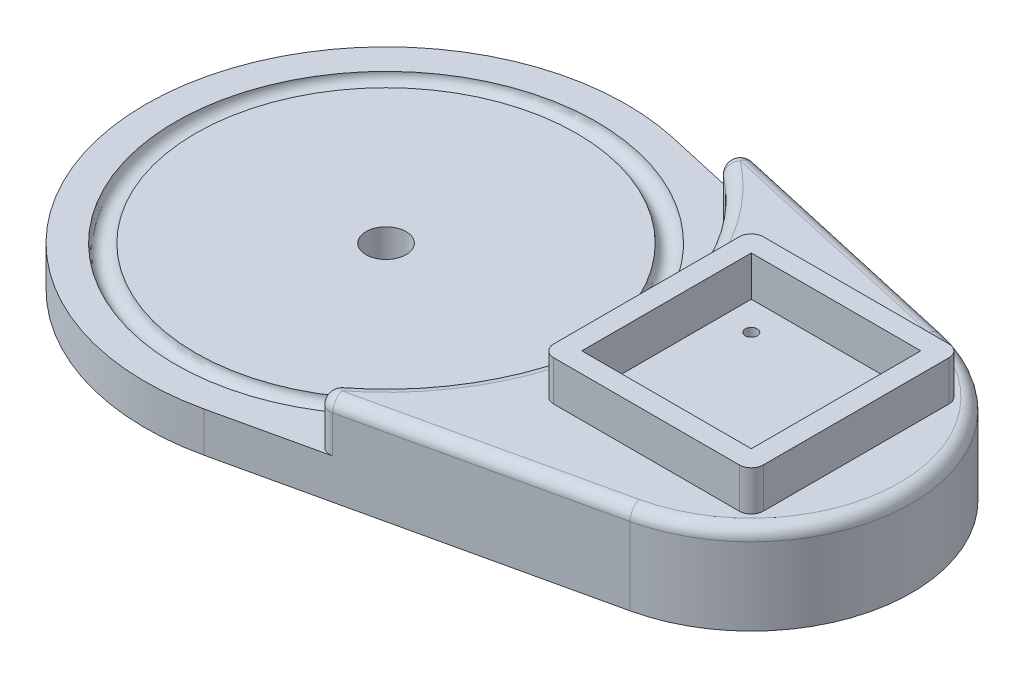
ISO-10303-21;
HEADER;
FILE_DESCRIPTION(('STEP AP214'),'2;1');
FILE_NAME('part.step','',(''),(''),'','','');
FILE_SCHEMA(('AUTOMOTIVE_DESIGN { 1 0 10303 214 1 1 1 1 }'));
ENDSEC;
DATA;
#1=APPLICATION_CONTEXT('core data for automotive mechanical design processes');
#2=APPLICATION_PROTOCOL_DEFINITION('international standard','automotive_design',2000,#1);
#3=PRODUCT_CONTEXT('',#1,'mechanical');
#4=PRODUCT('Part','Part','',(#3));
#5=PRODUCT_RELATED_PRODUCT_CATEGORY('part','',(#4));
#6=PRODUCT_DEFINITION_FORMATION('','',#4);
#7=PRODUCT_DEFINITION_CONTEXT('part definition',#1,'design');
#8=PRODUCT_DEFINITION('design','',#6,#7);
#9=PRODUCT_DEFINITION_SHAPE('','',#8);
#10=(LENGTH_UNIT() NAMED_UNIT(*) SI_UNIT(.MILLI.,.METRE.));
#11=(NAMED_UNIT(*) PLANE_ANGLE_UNIT() SI_UNIT($,.RADIAN.));
#12=(NAMED_UNIT(*) SI_UNIT($,.STERADIAN.) SOLID_ANGLE_UNIT());
#13=UNCERTAINTY_MEASURE_WITH_UNIT(LENGTH_MEASURE(1.E-05),#10,'distance_accuracy_value','');
#14=(GEOMETRIC_REPRESENTATION_CONTEXT(3) GLOBAL_UNCERTAINTY_ASSIGNED_CONTEXT((#13)) GLOBAL_UNIT_ASSIGNED_CONTEXT((#10,
#11,#12)) REPRESENTATION_CONTEXT('',''));
#15=CARTESIAN_POINT('',(0.,0.,0.));
#16=DIRECTION('',(0.,0.,1.));
#17=DIRECTION('',(1.,0.,0.));
#18=AXIS2_PLACEMENT_3D('',#15,#16,#17);
#19=CARTESIAN_POINT('',(0.,10.,0.));
#20=DIRECTION('',(0.,-1.,0.));
#21=DIRECTION('',(0.,0.,-1.));
#22=AXIS2_PLACEMENT_3D('',#19,#20,#21);
#23=CYLINDRICAL_SURFACE('',#22,60.);
#24=DIRECTION('',(0.,1.,0.));
#25=VECTOR('',#24,1.);
#26=CARTESIAN_POINT('',(13.1651124520022,0.,58.5378494149396));
#27=LINE('',#26,#25);
#28=CARTESIAN_POINT('',(13.1651124520022,0.,58.5378494149395));
#29=VERTEX_POINT('',#28);
#30=CARTESIAN_POINT('',(13.1651124520022,10.,58.5378494149395));
#31=VERTEX_POINT('',#30);
#32=EDGE_CURVE('E307',#29,#31,#27,.T.);
#33=ORIENTED_EDGE('',*,*,#32,.T.);
#34=CARTESIAN_POINT('',(0.,10.,0.));
#35=DIRECTION('',(0.,1.,0.));
#36=DIRECTION('',(0.,0.,1.));
#37=AXIS2_PLACEMENT_3D('',#34,#35,#36);
#38=CIRCLE('',#37,60.);
#39=CARTESIAN_POINT('',(13.1651124520022,10.,-58.5378494149395));
#40=VERTEX_POINT('',#39);
#41=EDGE_CURVE('E325',#40,#31,#38,.T.);
#42=ORIENTED_EDGE('',*,*,#41,.F.);
#43=DIRECTION('',(0.,1.,0.));
#44=VECTOR('',#43,1.);
#45=CARTESIAN_POINT('',(13.1651124520022,0.,-58.5378494149396));
#46=LINE('',#45,#44);
#47=CARTESIAN_POINT('',(13.1651124520022,0.,-58.5378494149396));
#48=VERTEX_POINT('',#47);
#49=EDGE_CURVE('E311',#48,#40,#46,.T.);
#50=ORIENTED_EDGE('',*,*,#49,.F.);
#51=CARTESIAN_POINT('',(0.,0.,0.));
#52=DIRECTION('',(0.,1.,0.));
#53=DIRECTION('',(0.,0.,1.));
#54=AXIS2_PLACEMENT_3D('',#51,#52,#53);
#55=CIRCLE('',#54,60.);
#56=EDGE_CURVE('E320',#48,#29,#55,.T.);
#57=ORIENTED_EDGE('',*,*,#56,.T.);
#58=EDGE_LOOP('',(#33,#42,#50,#57));
#59=FACE_BOUND('',#58,.T.);
#60=ADVANCED_FACE('F106',(#59),#23,.T.);
#61=CARTESIAN_POINT('',(0.,10.,0.));
#62=DIRECTION('',(0.,1.,0.));
#63=DIRECTION('',(0.,0.,1.));
#64=AXIS2_PLACEMENT_3D('',#61,#62,#63);
#65=PLANE('',#64);
#66=ORIENTED_EDGE('',*,*,#41,.T.);
#67=DIRECTION('',(-0.975630823582326,0.,0.219418540866703));
#68=VECTOR('',#67,1.);
#69=CARTESIAN_POINT('',(13.1651124520022,10.,58.5378494149396));
#70=LINE('',#69,#68);
#71=CARTESIAN_POINT('',(39.3440345616924,10.,52.6502321401184));
#72=VERTEX_POINT('',#71);
#73=EDGE_CURVE('E362',#72,#31,#70,.T.);
#74=ORIENTED_EDGE('',*,*,#73,.F.);
#75=CARTESIAN_POINT('',(38.6857789390923,10.,49.7233396693714));
#76=DIRECTION('',(0.,1.,0.));
#77=DIRECTION('',(0.,0.,1.));
#78=AXIS2_PLACEMENT_3D('',#75,#76,#77);
#79=CIRCLE('',#78,3.);
#80=CARTESIAN_POINT('',(36.8435989896117,10.,47.3555615898775));
#81=VERTEX_POINT('',#80);
#82=EDGE_CURVE('E366',#72,#81,#79,.F.);
#83=ORIENTED_EDGE('',*,*,#82,.T.);
#84=CARTESIAN_POINT('',(36.8435989896117,10.,-47.3555615898775));
#85=VERTEX_POINT('',#84);
#86=EDGE_CURVE('E321',#81,#85,#38,.T.);
#87=ORIENTED_EDGE('',*,*,#86,.T.);
#88=CARTESIAN_POINT('',(38.6857789390923,10.,-49.7233396693714));
#89=DIRECTION('',(0.,1.,0.));
#90=DIRECTION('',(0.,0.,1.));
#91=AXIS2_PLACEMENT_3D('',#88,#89,#90);
#92=CIRCLE('',#91,3.);
#93=CARTESIAN_POINT('',(39.3440345616924,10.,-52.6502321401184));
#94=VERTEX_POINT('',#93);
#95=EDGE_CURVE('E364',#85,#94,#92,.F.);
#96=ORIENTED_EDGE('',*,*,#95,.T.);
#97=DIRECTION('',(0.975630823582326,0.,0.219418540866703));
#98=VECTOR('',#97,1.);
#99=CARTESIAN_POINT('',(13.1651124520022,10.,-58.5378494149395));
#100=LINE('',#99,#98);
#101=EDGE_CURVE('E341',#40,#94,#100,.T.);
#102=ORIENTED_EDGE('',*,*,#101,.F.);
#103=EDGE_LOOP('',(#66,#74,#83,#87,#96,#102));
#104=FACE_BOUND('',#103,.T.);
#105=CARTESIAN_POINT('',(0.,10.,0.));
#106=DIRECTION('',(0.,1.,0.));
#107=DIRECTION('',(0.,0.,1.));
#108=AXIS2_PLACEMENT_3D('',#105,#106,#107);
#109=CIRCLE('',#108,52.5);
#110=CARTESIAN_POINT('',(52.5,10.,0.));
#111=VERTEX_POINT('',#110);
#112=EDGE_CURVE('E329',#111,#111,#109,.F.);
#113=ORIENTED_EDGE('',*,*,#112,.T.);
#114=EDGE_LOOP('',(#113));
#115=FACE_BOUND('',#114,.T.);
#116=ADVANCED_FACE('F486',(#104,#115),#65,.T.);
#117=CARTESIAN_POINT('',(0.,0.,0.));
#118=DIRECTION('',(0.,1.,0.));
#119=DIRECTION('',(0.,0.,1.));
#120=AXIS2_PLACEMENT_3D('',#117,#118,#119);
#121=PLANE('',#120);
#122=CARTESIAN_POINT('',(0.,0.,0.));
#123=DIRECTION('',(0.,1.,0.));
#124=DIRECTION('',(0.,0.,1.));
#125=AXIS2_PLACEMENT_3D('',#122,#123,#124);
#126=CIRCLE('',#125,5.);
#127=CARTESIAN_POINT('',(0.,0.,5.));
#128=VERTEX_POINT('',#127);
#129=EDGE_CURVE('E572',#128,#128,#126,.T.);
#130=ORIENTED_EDGE('',*,*,#129,.T.);
#131=EDGE_LOOP('',(#130));
#132=FACE_BOUND('',#131,.T.);
#133=CARTESIAN_POINT('',(105.15,0.,-14.));
#134=DIRECTION('',(0.,1.,0.));
#135=DIRECTION('',(0.,0.,1.));
#136=AXIS2_PLACEMENT_3D('',#133,#134,#135);
#137=CIRCLE('',#136,1.5);
#138=CARTESIAN_POINT('',(105.15,0.,-12.5));
#139=VERTEX_POINT('',#138);
#140=EDGE_CURVE('E564',#139,#139,#137,.T.);
#141=ORIENTED_EDGE('',*,*,#140,.T.);
#142=EDGE_LOOP('',(#141));
#143=FACE_BOUND('',#142,.T.);
#144=CARTESIAN_POINT('',(105.15,0.,14.));
#145=DIRECTION('',(0.,1.,0.));
#146=DIRECTION('',(0.,0.,1.));
#147=AXIS2_PLACEMENT_3D('',#144,#145,#146);
#148=CIRCLE('',#147,1.5);
#149=CARTESIAN_POINT('',(105.15,0.,15.5));
#150=VERTEX_POINT('',#149);
#151=EDGE_CURVE('E567',#150,#150,#148,.T.);
#152=ORIENTED_EDGE('',*,*,#151,.T.);
#153=EDGE_LOOP('',(#152));
#154=FACE_BOUND('',#153,.T.);
#155=CARTESIAN_POINT('',(77.15,0.,14.));
#156=DIRECTION('',(0.,1.,0.));
#157=DIRECTION('',(0.,0.,1.));
#158=AXIS2_PLACEMENT_3D('',#155,#156,#157);
#159=CIRCLE('',#158,1.5);
#160=CARTESIAN_POINT('',(77.15,0.,15.5));
#161=VERTEX_POINT('',#160);
#162=EDGE_CURVE('E563',#161,#161,#159,.T.);
#163=ORIENTED_EDGE('',*,*,#162,.T.);
#164=EDGE_LOOP('',(#163));
#165=FACE_BOUND('',#164,.T.);
#166=CARTESIAN_POINT('',(77.15,0.,-14.));
#167=DIRECTION('',(0.,1.,0.));
#168=DIRECTION('',(0.,0.,1.));
#169=AXIS2_PLACEMENT_3D('',#166,#167,#168);
#170=CIRCLE('',#169,1.5);
#171=CARTESIAN_POINT('',(77.15,0.,-12.5));
#172=VERTEX_POINT('',#171);
#173=EDGE_CURVE('E422',#172,#172,#170,.T.);
#174=ORIENTED_EDGE('',*,*,#173,.T.);
#175=EDGE_LOOP('',(#174));
#176=FACE_BOUND('',#175,.T.);
#177=ORIENTED_EDGE('',*,*,#56,.F.);
#178=DIRECTION('',(-0.975630823582326,0.,-0.219418540866703));
#179=VECTOR('',#178,1.);
#180=CARTESIAN_POINT('',(13.1651124520022,0.,-58.5378494149395));
#181=LINE('',#180,#179);
#182=CARTESIAN_POINT('',(99.9267416346681,0.,-39.025232943293));
#183=VERTEX_POINT('',#182);
#184=EDGE_CURVE('E303',#183,#48,#181,.T.);
#185=ORIENTED_EDGE('',*,*,#184,.F.);
#186=CARTESIAN_POINT('',(91.15,0.,0.));
#187=DIRECTION('',(0.,1.,0.));
#188=DIRECTION('',(0.,0.,1.));
#189=AXIS2_PLACEMENT_3D('',#186,#187,#188);
#190=CIRCLE('',#189,40.);
#191=CARTESIAN_POINT('',(99.9267416346681,0.,39.025232943293));
#192=VERTEX_POINT('',#191);
#193=EDGE_CURVE('E299',#192,#183,#190,.T.);
#194=ORIENTED_EDGE('',*,*,#193,.F.);
#195=DIRECTION('',(-0.975630823582326,0.,0.219418540866703));
#196=VECTOR('',#195,1.);
#197=CARTESIAN_POINT('',(13.1651124520022,0.,58.5378494149395));
#198=LINE('',#197,#196);
#199=EDGE_CURVE('E296',#192,#29,#198,.T.);
#200=ORIENTED_EDGE('',*,*,#199,.T.);
#201=EDGE_LOOP('',(#177,#185,#194,#200));
#202=FACE_BOUND('',#201,.T.);
#203=ADVANCED_FACE('F493',(#132,#143,#154,#165,#176,#202),#121,.F.);
#204=CARTESIAN_POINT('',(0.,10.,0.));
#205=DIRECTION('',(0.,1.,0.));
#206=DIRECTION('',(0.,0.,1.));
#207=AXIS2_PLACEMENT_3D('',#204,#205,#206);
#208=TOROIDAL_SURFACE('',#207,50.,2.5);
#209=CARTESIAN_POINT('',(50.,10.,0.));
#210=DIRECTION('',(0.,0.,1.));
#211=DIRECTION('',(1.,0.,0.));
#212=AXIS2_PLACEMENT_3D('',#209,#210,#211);
#213=CIRCLE('',#212,2.5);
#214=CARTESIAN_POINT('',(47.5,10.,0.));
#215=VERTEX_POINT('',#214);
#216=EDGE_CURVE('E310',#215,#111,#213,.T.);
#217=ORIENTED_EDGE('',*,*,#216,.F.);
#218=CARTESIAN_POINT('',(0.,10.,0.));
#219=DIRECTION('',(0.,-1.,0.));
#220=DIRECTION('',(0.,0.,-1.));
#221=AXIS2_PLACEMENT_3D('',#218,#219,#220);
#222=CIRCLE('',#221,47.5);
#223=EDGE_CURVE('E324',#215,#215,#222,.F.);
#224=ORIENTED_EDGE('',*,*,#223,.F.);
#225=ORIENTED_EDGE('',*,*,#216,.T.);
#226=ORIENTED_EDGE('',*,*,#112,.F.);
#227=EDGE_LOOP('',(#217,#224,#225,#226));
#228=FACE_BOUND('',#227,.T.);
#229=ADVANCED_FACE('F584',(#228),#208,.F.);
#230=CARTESIAN_POINT('',(0.,10.,0.));
#231=DIRECTION('',(0.,1.,0.));
#232=DIRECTION('',(0.,0.,1.));
#233=AXIS2_PLACEMENT_3D('',#230,#231,#232);
#234=CIRCLE('',#233,5.);
#235=CARTESIAN_POINT('',(0.,10.,5.));
#236=VERTEX_POINT('',#235);
#237=EDGE_CURVE('E110',#236,#236,#234,.T.);
#238=ORIENTED_EDGE('',*,*,#237,.F.);
#239=EDGE_LOOP('',(#238));
#240=FACE_BOUND('',#239,.T.);
#241=ORIENTED_EDGE('',*,*,#223,.T.);
#242=EDGE_LOOP('',(#241));
#243=FACE_BOUND('',#242,.T.);
#244=ADVANCED_FACE('F484',(#240,#243),#65,.T.);
#245=CARTESIAN_POINT('',(0.,22.3,0.));
#246=DIRECTION('',(0.,1.,0.));
#247=DIRECTION('',(0.,0.,1.));
#248=AXIS2_PLACEMENT_3D('',#245,#246,#247);
#249=PLANE('',#248);
#250=DIRECTION('',(0.,0.,1.));
#251=VECTOR('',#250,1.);
#252=CARTESIAN_POINT('',(65.,22.3,0.));
#253=LINE('',#252,#251);
#254=CARTESIAN_POINT('',(65.,22.3,-23.15));
#255=VERTEX_POINT('',#254);
#256=CARTESIAN_POINT('',(65.,22.3,23.15));
#257=VERTEX_POINT('',#256);
#258=EDGE_CURVE('E433',#255,#257,#253,.T.);
#259=ORIENTED_EDGE('',*,*,#258,.F.);
#260=CARTESIAN_POINT('',(68.,22.3,-23.15));
#261=DIRECTION('',(0.,1.,0.));
#262=DIRECTION('',(0.,0.,1.));
#263=AXIS2_PLACEMENT_3D('',#260,#261,#262);
#264=CIRCLE('',#263,3.);
#265=CARTESIAN_POINT('',(68.,22.3,-26.15));
#266=VERTEX_POINT('',#265);
#267=EDGE_CURVE('E413',#255,#266,#264,.F.);
#268=ORIENTED_EDGE('',*,*,#267,.T.);
#269=DIRECTION('',(1.,0.,0.));
#270=VECTOR('',#269,1.);
#271=CARTESIAN_POINT('',(0.,22.3,-26.15));
#272=LINE('',#271,#270);
#273=CARTESIAN_POINT('',(114.3,22.3,-26.15));
#274=VERTEX_POINT('',#273);
#275=EDGE_CURVE('E429',#266,#274,#272,.T.);
#276=ORIENTED_EDGE('',*,*,#275,.T.);
#277=CARTESIAN_POINT('',(114.3,22.3,-23.15));
#278=DIRECTION('',(0.,1.,0.));
#279=DIRECTION('',(0.,0.,1.));
#280=AXIS2_PLACEMENT_3D('',#277,#278,#279);
#281=CIRCLE('',#280,3.);
#282=CARTESIAN_POINT('',(117.3,22.3,-23.15));
#283=VERTEX_POINT('',#282);
#284=EDGE_CURVE('E415',#274,#283,#281,.F.);
#285=ORIENTED_EDGE('',*,*,#284,.T.);
#286=DIRECTION('',(0.,0.,1.));
#287=VECTOR('',#286,1.);
#288=CARTESIAN_POINT('',(117.3,22.3,0.));
#289=LINE('',#288,#287);
#290=CARTESIAN_POINT('',(117.3,22.3,23.15));
#291=VERTEX_POINT('',#290);
#292=EDGE_CURVE('E443',#283,#291,#289,.T.);
#293=ORIENTED_EDGE('',*,*,#292,.T.);
#294=CARTESIAN_POINT('',(114.3,22.3,23.15));
#295=DIRECTION('',(0.,1.,0.));
#296=DIRECTION('',(0.,0.,1.));
#297=AXIS2_PLACEMENT_3D('',#294,#295,#296);
#298=CIRCLE('',#297,3.);
#299=CARTESIAN_POINT('',(114.3,22.3,26.15));
#300=VERTEX_POINT('',#299);
#301=EDGE_CURVE('E115',#291,#300,#298,.F.);
#302=ORIENTED_EDGE('',*,*,#301,.T.);
#303=DIRECTION('',(1.,0.,0.));
#304=VECTOR('',#303,1.);
#305=CARTESIAN_POINT('',(0.,22.3,26.15));
#306=LINE('',#305,#304);
#307=CARTESIAN_POINT('',(68.,22.3,26.15));
#308=VERTEX_POINT('',#307);
#309=EDGE_CURVE('E437',#308,#300,#306,.T.);
#310=ORIENTED_EDGE('',*,*,#309,.F.);
#311=CARTESIAN_POINT('',(68.,22.3,23.15));
#312=DIRECTION('',(0.,1.,0.));
#313=DIRECTION('',(0.,0.,1.));
#314=AXIS2_PLACEMENT_3D('',#311,#312,#313);
#315=CIRCLE('',#314,3.);
#316=EDGE_CURVE('E12',#308,#257,#315,.F.);
#317=ORIENTED_EDGE('',*,*,#316,.T.);
#318=EDGE_LOOP('',(#259,#268,#276,#285,#293,#302,#310,#317));
#319=FACE_BOUND('',#318,.T.);
#320=CARTESIAN_POINT('',(91.15,22.3,0.));
#321=DIRECTION('',(0.,1.,0.));
#322=DIRECTION('',(0.,0.,1.));
#323=AXIS2_PLACEMENT_3D('',#320,#321,#322);
#324=CIRCLE('',#323,37.);
#325=CARTESIAN_POINT('',(99.268486012068,22.3,36.098340472546));
#326=VERTEX_POINT('',#325);
#327=CARTESIAN_POINT('',(99.268486012068,22.3,-36.098340472546));
#328=VERTEX_POINT('',#327);
#329=EDGE_CURVE('E336',#326,#328,#324,.T.);
#330=ORIENTED_EDGE('',*,*,#329,.T.);
#331=DIRECTION('',(-0.975630823582326,0.,-0.219418540866703));
#332=VECTOR('',#331,1.);
#333=CARTESIAN_POINT('',(12.5068568294021,22.3,-55.6109569441926));
#334=LINE('',#333,#332);
#335=CARTESIAN_POINT('',(38.6857789390923,22.3,-49.7233396693714));
#336=VERTEX_POINT('',#335);
#337=EDGE_CURVE('E338',#328,#336,#334,.T.);
#338=ORIENTED_EDGE('',*,*,#337,.T.);
#339=CARTESIAN_POINT('',(0.,22.3,0.));
#340=DIRECTION('',(0.,1.,0.));
#341=DIRECTION('',(0.,0.,1.));
#342=AXIS2_PLACEMENT_3D('',#339,#340,#341);
#343=CIRCLE('',#342,63.);
#344=CARTESIAN_POINT('',(38.6857789390923,22.3,49.7233396693714));
#345=VERTEX_POINT('',#344);
#346=EDGE_CURVE('E332',#336,#345,#343,.F.);
#347=ORIENTED_EDGE('',*,*,#346,.T.);
#348=DIRECTION('',(-0.975630823582326,0.,0.219418540866703));
#349=VECTOR('',#348,1.);
#350=CARTESIAN_POINT('',(99.268486012068,22.3,36.098340472546));
#351=LINE('',#350,#349);
#352=EDGE_CURVE('E334',#345,#326,#351,.F.);
#353=ORIENTED_EDGE('',*,*,#352,.T.);
#354=EDGE_LOOP('',(#330,#338,#347,#353));
#355=FACE_BOUND('',#354,.T.);
#356=ADVANCED_FACE('F467',(#319,#355),#249,.T.);
#357=CARTESIAN_POINT('',(13.1651124520022,0.,58.5378494149395));
#358=DIRECTION('',(-0.219418540866703,0.,-0.975630823582325));
#359=DIRECTION('',(-0.975630823582326,0.,0.219418540866703));
#360=AXIS2_PLACEMENT_3D('',#357,#358,#359);
#361=PLANE('',#360);
#362=DIRECTION('',(0.,1.,0.));
#363=VECTOR('',#362,1.);
#364=CARTESIAN_POINT('',(39.3440345616924,0.,52.6502321401184));
#365=LINE('',#364,#363);
#366=CARTESIAN_POINT('',(39.3440345616924,19.3,52.6502321401184));
#367=VERTEX_POINT('',#366);
#368=EDGE_CURVE('E359',#367,#72,#365,.F.);
#369=ORIENTED_EDGE('',*,*,#368,.T.);
#370=ORIENTED_EDGE('',*,*,#73,.T.);
#371=ORIENTED_EDGE('',*,*,#32,.F.);
#372=ORIENTED_EDGE('',*,*,#199,.F.);
#373=DIRECTION('',(0.,1.,0.));
#374=VECTOR('',#373,1.);
#375=CARTESIAN_POINT('',(99.9267416346681,0.,39.025232943293));
#376=LINE('',#375,#374);
#377=CARTESIAN_POINT('',(99.9267416346681,19.3,39.025232943293));
#378=VERTEX_POINT('',#377);
#379=EDGE_CURVE('E306',#192,#378,#376,.T.);
#380=ORIENTED_EDGE('',*,*,#379,.T.);
#381=DIRECTION('',(-0.975630823582326,0.,0.219418540866703));
#382=VECTOR('',#381,1.);
#383=CARTESIAN_POINT('',(13.1651124520022,19.3,58.5378494149395));
#384=LINE('',#383,#382);
#385=EDGE_CURVE('E357',#378,#367,#384,.T.);
#386=ORIENTED_EDGE('',*,*,#385,.T.);
#387=EDGE_LOOP('',(#369,#370,#371,#372,#380,#386));
#388=FACE_BOUND('',#387,.T.);
#389=ADVANCED_FACE('F483',(#388),#361,.F.);
#390=CARTESIAN_POINT('',(0.,0.,0.));
#391=DIRECTION('',(0.,1.,0.));
#392=DIRECTION('',(0.,0.,1.));
#393=AXIS2_PLACEMENT_3D('',#390,#391,#392);
#394=CYLINDRICAL_SURFACE('',#393,60.);
#395=CARTESIAN_POINT('',(0.,19.3,0.));
#396=DIRECTION('',(0.,1.,0.));
#397=DIRECTION('',(0.,0.,1.));
#398=AXIS2_PLACEMENT_3D('',#395,#396,#397);
#399=CIRCLE('',#398,60.);
#400=CARTESIAN_POINT('',(36.8435989896117,19.3,47.3555615898775));
#401=VERTEX_POINT('',#400);
#402=CARTESIAN_POINT('',(36.8435989896117,19.3,-47.3555615898775));
#403=VERTEX_POINT('',#402);
#404=EDGE_CURVE('E351',#401,#403,#399,.T.);
#405=ORIENTED_EDGE('',*,*,#404,.T.);
#406=DIRECTION('',(0.,1.,0.));
#407=VECTOR('',#406,1.);
#408=CARTESIAN_POINT('',(36.8435989896117,0.,-47.3555615898775));
#409=LINE('',#408,#407);
#410=EDGE_CURVE('E355',#403,#85,#409,.F.);
#411=ORIENTED_EDGE('',*,*,#410,.T.);
#412=ORIENTED_EDGE('',*,*,#86,.F.);
#413=DIRECTION('',(0.,1.,0.));
#414=VECTOR('',#413,1.);
#415=CARTESIAN_POINT('',(36.8435989896117,0.,47.3555615898775));
#416=LINE('',#415,#414);
#417=EDGE_CURVE('E353',#81,#401,#416,.T.);
#418=ORIENTED_EDGE('',*,*,#417,.T.);
#419=EDGE_LOOP('',(#405,#411,#412,#418));
#420=FACE_BOUND('',#419,.T.);
#421=ADVANCED_FACE('F596',(#420),#394,.F.);
#422=CARTESIAN_POINT('',(13.1651124520022,0.,-58.5378494149395));
#423=DIRECTION('',(0.219418540866703,0.,-0.975630823582325));
#424=DIRECTION('',(-0.975630823582326,0.,-0.219418540866703));
#425=AXIS2_PLACEMENT_3D('',#422,#423,#424);
#426=PLANE('',#425);
#427=DIRECTION('',(0.,-1.,0.));
#428=VECTOR('',#427,1.);
#429=CARTESIAN_POINT('',(39.3440345616924,22.3,-52.6502321401184));
#430=LINE('',#429,#428);
#431=CARTESIAN_POINT('',(39.3440345616924,19.3,-52.6502321401184));
#432=VERTEX_POINT('',#431);
#433=EDGE_CURVE('E344',#94,#432,#430,.F.);
#434=ORIENTED_EDGE('',*,*,#433,.T.);
#435=DIRECTION('',(-0.975630823582326,0.,-0.219418540866703));
#436=VECTOR('',#435,1.);
#437=CARTESIAN_POINT('',(13.1651124520022,19.3,-58.5378494149395));
#438=LINE('',#437,#436);
#439=CARTESIAN_POINT('',(99.9267416346681,19.3,-39.025232943293));
#440=VERTEX_POINT('',#439);
#441=EDGE_CURVE('E346',#432,#440,#438,.F.);
#442=ORIENTED_EDGE('',*,*,#441,.T.);
#443=DIRECTION('',(0.,1.,0.));
#444=VECTOR('',#443,1.);
#445=CARTESIAN_POINT('',(99.9267416346681,0.,-39.025232943293));
#446=LINE('',#445,#444);
#447=EDGE_CURVE('E314',#183,#440,#446,.T.);
#448=ORIENTED_EDGE('',*,*,#447,.F.);
#449=ORIENTED_EDGE('',*,*,#184,.T.);
#450=ORIENTED_EDGE('',*,*,#49,.T.);
#451=ORIENTED_EDGE('',*,*,#101,.T.);
#452=EDGE_LOOP('',(#434,#442,#448,#449,#450,#451));
#453=FACE_BOUND('',#452,.T.);
#454=ADVANCED_FACE('F600',(#453),#426,.T.);
#455=CARTESIAN_POINT('',(91.15,0.,0.));
#456=DIRECTION('',(0.,1.,0.));
#457=DIRECTION('',(0.,0.,1.));
#458=AXIS2_PLACEMENT_3D('',#455,#456,#457);
#459=CYLINDRICAL_SURFACE('',#458,40.);
#460=ORIENTED_EDGE('',*,*,#447,.T.);
#461=CARTESIAN_POINT('',(91.15,19.3,0.));
#462=DIRECTION('',(0.,1.,0.));
#463=DIRECTION('',(0.,0.,1.));
#464=AXIS2_PLACEMENT_3D('',#461,#462,#463);
#465=CIRCLE('',#464,40.);
#466=EDGE_CURVE('E349',#440,#378,#465,.F.);
#467=ORIENTED_EDGE('',*,*,#466,.T.);
#468=ORIENTED_EDGE('',*,*,#379,.F.);
#469=ORIENTED_EDGE('',*,*,#193,.T.);
#470=EDGE_LOOP('',(#460,#467,#468,#469));
#471=FACE_BOUND('',#470,.T.);
#472=ADVANCED_FACE('F528',(#471),#459,.T.);
#473=CARTESIAN_POINT('',(38.6857789390923,0.,49.7233396693714));
#474=DIRECTION('',(0.,1.,0.));
#475=DIRECTION('',(0.,0.,1.));
#476=AXIS2_PLACEMENT_3D('',#473,#474,#475);
#477=CYLINDRICAL_SURFACE('',#476,3.);
#478=CARTESIAN_POINT('',(38.6857789390923,19.3,49.7233396693714));
#479=DIRECTION('',(0.,1.,0.));
#480=DIRECTION('',(0.,0.,1.));
#481=AXIS2_PLACEMENT_3D('',#478,#479,#480);
#482=CIRCLE('',#481,3.);
#483=EDGE_CURVE('E300',#401,#367,#482,.T.);
#484=ORIENTED_EDGE('',*,*,#483,.F.);
#485=ORIENTED_EDGE('',*,*,#417,.F.);
#486=ORIENTED_EDGE('',*,*,#82,.F.);
#487=ORIENTED_EDGE('',*,*,#368,.F.);
#488=EDGE_LOOP('',(#484,#485,#486,#487));
#489=FACE_BOUND('',#488,.T.);
#490=ADVANCED_FACE('F525',(#489),#477,.T.);
#491=CARTESIAN_POINT('',(38.6857789390923,19.3,49.7233396693714));
#492=DIRECTION('',(0.,1.,0.));
#493=DIRECTION('',(0.,0.,1.));
#494=AXIS2_PLACEMENT_3D('',#491,#492,#493);
#495=SPHERICAL_SURFACE('',#494,3.);
#496=CARTESIAN_POINT('',(38.6857789390923,19.3,49.7233396693714));
#497=DIRECTION('',(-0.789259359831293,0.,0.614059983160194));
#498=DIRECTION('',(0.614059983160194,0.,0.789259359831293));
#499=AXIS2_PLACEMENT_3D('',#496,#497,#498);
#500=CIRCLE('',#499,3.);
#501=EDGE_CURVE('E379',#401,#345,#500,.F.);
#502=ORIENTED_EDGE('',*,*,#501,.F.);
#503=ORIENTED_EDGE('',*,*,#483,.T.);
#504=CARTESIAN_POINT('',(38.6857789390923,19.3,49.7233396693714));
#505=DIRECTION('',(-0.975630823582325,0.,0.219418540866705));
#506=DIRECTION('',(0.219418540866705,0.,0.975630823582325));
#507=AXIS2_PLACEMENT_3D('',#504,#505,#506);
#508=CIRCLE('',#507,3.);
#509=EDGE_CURVE('E382',#345,#367,#508,.F.);
#510=ORIENTED_EDGE('',*,*,#509,.F.);
#511=EDGE_LOOP('',(#502,#503,#510));
#512=FACE_BOUND('',#511,.T.);
#513=ADVANCED_FACE('F521',(#512),#495,.T.);
#514=CARTESIAN_POINT('',(12.5068568294021,19.3,55.6109569441926));
#515=DIRECTION('',(0.975630823582326,0.,-0.219418540866703));
#516=DIRECTION('',(-0.219418540866703,0.,-0.975630823582326));
#517=AXIS2_PLACEMENT_3D('',#514,#515,#516);
#518=CYLINDRICAL_SURFACE('',#517,3.);
#519=ORIENTED_EDGE('',*,*,#509,.T.);
#520=ORIENTED_EDGE('',*,*,#385,.F.);
#521=CARTESIAN_POINT('',(99.268486012068,19.3,36.098340472546));
#522=DIRECTION('',(0.975630823582326,0.,-0.219418540866702));
#523=DIRECTION('',(-0.219418540866702,0.,-0.975630823582326));
#524=AXIS2_PLACEMENT_3D('',#521,#522,#523);
#525=CIRCLE('',#524,3.);
#526=EDGE_CURVE('E376',#326,#378,#525,.T.);
#527=ORIENTED_EDGE('',*,*,#526,.F.);
#528=ORIENTED_EDGE('',*,*,#352,.F.);
#529=EDGE_LOOP('',(#519,#520,#527,#528));
#530=FACE_BOUND('',#529,.T.);
#531=ADVANCED_FACE('F517',(#530),#518,.T.);
#532=CARTESIAN_POINT('',(0.,19.3,0.));
#533=DIRECTION('',(0.,1.,0.));
#534=DIRECTION('',(0.,0.,1.));
#535=AXIS2_PLACEMENT_3D('',#532,#533,#534);
#536=TOROIDAL_SURFACE('',#535,63.,3.);
#537=ORIENTED_EDGE('',*,*,#501,.T.);
#538=ORIENTED_EDGE('',*,*,#346,.F.);
#539=CARTESIAN_POINT('',(38.6857789390923,19.3,-49.7233396693714));
#540=DIRECTION('',(-0.789259359831291,0.,-0.614059983160196));
#541=DIRECTION('',(-0.614059983160196,0.,0.789259359831291));
#542=AXIS2_PLACEMENT_3D('',#539,#540,#541);
#543=CIRCLE('',#542,3.);
#544=EDGE_CURVE('E373',#403,#336,#543,.T.);
#545=ORIENTED_EDGE('',*,*,#544,.F.);
#546=ORIENTED_EDGE('',*,*,#404,.F.);
#547=EDGE_LOOP('',(#537,#538,#545,#546));
#548=FACE_BOUND('',#547,.T.);
#549=ADVANCED_FACE('F513',(#548),#536,.T.);
#550=CARTESIAN_POINT('',(38.6857789390923,0.,-49.7233396693714));
#551=DIRECTION('',(0.,1.,0.));
#552=DIRECTION('',(0.,0.,1.));
#553=AXIS2_PLACEMENT_3D('',#550,#551,#552);
#554=CYLINDRICAL_SURFACE('',#553,3.);
#555=ORIENTED_EDGE('',*,*,#95,.F.);
#556=ORIENTED_EDGE('',*,*,#410,.F.);
#557=CARTESIAN_POINT('',(38.6857789390923,19.3,-49.7233396693714));
#558=DIRECTION('',(0.,1.,0.));
#559=DIRECTION('',(0.,0.,1.));
#560=AXIS2_PLACEMENT_3D('',#557,#558,#559);
#561=CIRCLE('',#560,3.);
#562=EDGE_CURVE('E370',#432,#403,#561,.T.);
#563=ORIENTED_EDGE('',*,*,#562,.F.);
#564=ORIENTED_EDGE('',*,*,#433,.F.);
#565=EDGE_LOOP('',(#555,#556,#563,#564));
#566=FACE_BOUND('',#565,.T.);
#567=ADVANCED_FACE('F509',(#566),#554,.T.);
#568=CARTESIAN_POINT('',(91.15,19.3,0.));
#569=DIRECTION('',(0.,1.,0.));
#570=DIRECTION('',(0.,0.,1.));
#571=AXIS2_PLACEMENT_3D('',#568,#569,#570);
#572=TOROIDAL_SURFACE('',#571,37.,3.);
#573=ORIENTED_EDGE('',*,*,#526,.T.);
#574=ORIENTED_EDGE('',*,*,#466,.F.);
#575=CARTESIAN_POINT('',(99.268486012068,19.3,-36.098340472546));
#576=DIRECTION('',(-0.975630823582326,0.,-0.219418540866702));
#577=DIRECTION('',(-0.219418540866702,0.,0.975630823582326));
#578=AXIS2_PLACEMENT_3D('',#575,#576,#577);
#579=CIRCLE('',#578,3.);
#580=EDGE_CURVE('E290',#328,#440,#579,.T.);
#581=ORIENTED_EDGE('',*,*,#580,.F.);
#582=ORIENTED_EDGE('',*,*,#329,.F.);
#583=EDGE_LOOP('',(#573,#574,#581,#582));
#584=FACE_BOUND('',#583,.T.);
#585=ADVANCED_FACE('F505',(#584),#572,.T.);
#586=CARTESIAN_POINT('',(38.6857789390923,19.3,-49.7233396693714));
#587=DIRECTION('',(0.,1.,0.));
#588=DIRECTION('',(0.,0.,1.));
#589=AXIS2_PLACEMENT_3D('',#586,#587,#588);
#590=SPHERICAL_SURFACE('',#589,3.);
#591=ORIENTED_EDGE('',*,*,#562,.T.);
#592=ORIENTED_EDGE('',*,*,#544,.T.);
#593=CARTESIAN_POINT('',(38.6857789390923,19.3,-49.7233396693714));
#594=DIRECTION('',(-0.975630823582321,0.,-0.219418540866721));
#595=DIRECTION('',(-0.219418540866721,0.,0.975630823582322));
#596=AXIS2_PLACEMENT_3D('',#593,#594,#595);
#597=CIRCLE('',#596,3.);
#598=EDGE_CURVE('E288',#432,#336,#597,.F.);
#599=ORIENTED_EDGE('',*,*,#598,.F.);
#600=EDGE_LOOP('',(#591,#592,#599));
#601=FACE_BOUND('',#600,.T.);
#602=ADVANCED_FACE('F501',(#601),#590,.T.);
#603=CARTESIAN_POINT('',(12.5068568294021,19.3,-55.6109569441926));
#604=DIRECTION('',(-0.975630823582326,0.,-0.219418540866703));
#605=DIRECTION('',(-0.219418540866703,0.,0.975630823582326));
#606=AXIS2_PLACEMENT_3D('',#603,#604,#605);
#607=CYLINDRICAL_SURFACE('',#606,3.);
#608=ORIENTED_EDGE('',*,*,#580,.T.);
#609=ORIENTED_EDGE('',*,*,#441,.F.);
#610=ORIENTED_EDGE('',*,*,#598,.T.);
#611=ORIENTED_EDGE('',*,*,#337,.F.);
#612=EDGE_LOOP('',(#608,#609,#610,#611));
#613=FACE_BOUND('',#612,.T.);
#614=ADVANCED_FACE('F498',(#613),#607,.T.);
#615=CARTESIAN_POINT('',(0.,32.3,-21.15));
#616=DIRECTION('',(0.,0.,-1.));
#617=DIRECTION('',(-1.,0.,0.));
#618=AXIS2_PLACEMENT_3D('',#615,#616,#617);
#619=PLANE('',#618);
#620=DIRECTION('',(1.,0.,0.));
#621=VECTOR('',#620,1.);
#622=CARTESIAN_POINT('',(0.,22.3,-21.15));
#623=LINE('',#622,#621);
#624=CARTESIAN_POINT('',(70.,22.3,-21.15));
#625=VERTEX_POINT('',#624);
#626=CARTESIAN_POINT('',(112.3,22.3,-21.15));
#627=VERTEX_POINT('',#626);
#628=EDGE_CURVE('E287',#625,#627,#623,.T.);
#629=ORIENTED_EDGE('',*,*,#628,.T.);
#630=DIRECTION('',(0.,-1.,0.));
#631=VECTOR('',#630,1.);
#632=CARTESIAN_POINT('',(112.3,32.3,-21.15));
#633=LINE('',#632,#631);
#634=CARTESIAN_POINT('',(112.3,32.3,-21.15));
#635=VERTEX_POINT('',#634);
#636=EDGE_CURVE('E267',#635,#627,#633,.T.);
#637=ORIENTED_EDGE('',*,*,#636,.F.);
#638=DIRECTION('',(1.,0.,0.));
#639=VECTOR('',#638,1.);
#640=CARTESIAN_POINT('',(0.,32.3,-21.15));
#641=LINE('',#640,#639);
#642=CARTESIAN_POINT('',(70.,32.3,-21.15));
#643=VERTEX_POINT('',#642);
#644=EDGE_CURVE('E275',#643,#635,#641,.T.);
#645=ORIENTED_EDGE('',*,*,#644,.F.);
#646=DIRECTION('',(0.,-1.,0.));
#647=VECTOR('',#646,1.);
#648=CARTESIAN_POINT('',(70.,32.3,-21.15));
#649=LINE('',#648,#647);
#650=EDGE_CURVE('E453',#643,#625,#649,.T.);
#651=ORIENTED_EDGE('',*,*,#650,.T.);
#652=EDGE_LOOP('',(#629,#637,#645,#651));
#653=FACE_BOUND('',#652,.T.);
#654=ADVANCED_FACE('F286',(#653),#619,.F.);
#655=CARTESIAN_POINT('',(112.3,32.3,0.));
#656=DIRECTION('',(1.,0.,0.));
#657=DIRECTION('',(0.,0.,-1.));
#658=AXIS2_PLACEMENT_3D('',#655,#656,#657);
#659=PLANE('',#658);
#660=DIRECTION('',(0.,0.,1.));
#661=VECTOR('',#660,1.);
#662=CARTESIAN_POINT('',(112.3,22.3,0.));
#663=LINE('',#662,#661);
#664=CARTESIAN_POINT('',(112.3,22.3,21.15));
#665=VERTEX_POINT('',#664);
#666=EDGE_CURVE('E446',#627,#665,#663,.T.);
#667=ORIENTED_EDGE('',*,*,#666,.T.);
#668=DIRECTION('',(0.,-1.,0.));
#669=VECTOR('',#668,1.);
#670=CARTESIAN_POINT('',(112.3,32.3,21.15));
#671=LINE('',#670,#669);
#672=CARTESIAN_POINT('',(112.3,32.3,21.15));
#673=VERTEX_POINT('',#672);
#674=EDGE_CURVE('E270',#673,#665,#671,.T.);
#675=ORIENTED_EDGE('',*,*,#674,.F.);
#676=DIRECTION('',(0.,0.,1.));
#677=VECTOR('',#676,1.);
#678=CARTESIAN_POINT('',(112.3,32.3,0.));
#679=LINE('',#678,#677);
#680=EDGE_CURVE('E262',#635,#673,#679,.T.);
#681=ORIENTED_EDGE('',*,*,#680,.F.);
#682=ORIENTED_EDGE('',*,*,#636,.T.);
#683=EDGE_LOOP('',(#667,#675,#681,#682));
#684=FACE_BOUND('',#683,.T.);
#685=ADVANCED_FACE('F265',(#684),#659,.F.);
#686=CARTESIAN_POINT('',(0.,32.3,21.15));
#687=DIRECTION('',(0.,0.,-1.));
#688=DIRECTION('',(-1.,0.,0.));
#689=AXIS2_PLACEMENT_3D('',#686,#687,#688);
#690=PLANE('',#689);
#691=DIRECTION('',(1.,0.,0.));
#692=VECTOR('',#691,1.);
#693=CARTESIAN_POINT('',(0.,22.3,21.15));
#694=LINE('',#693,#692);
#695=CARTESIAN_POINT('',(70.,22.3,21.15));
#696=VERTEX_POINT('',#695);
#697=EDGE_CURVE('E448',#696,#665,#694,.T.);
#698=ORIENTED_EDGE('',*,*,#697,.F.);
#699=DIRECTION('',(0.,-1.,0.));
#700=VECTOR('',#699,1.);
#701=CARTESIAN_POINT('',(70.,32.3,21.15));
#702=LINE('',#701,#700);
#703=CARTESIAN_POINT('',(70.,32.3,21.15));
#704=VERTEX_POINT('',#703);
#705=EDGE_CURVE('E292',#704,#696,#702,.T.);
#706=ORIENTED_EDGE('',*,*,#705,.F.);
#707=DIRECTION('',(1.,0.,0.));
#708=VECTOR('',#707,1.);
#709=CARTESIAN_POINT('',(0.,32.3,21.15));
#710=LINE('',#709,#708);
#711=EDGE_CURVE('E274',#704,#673,#710,.T.);
#712=ORIENTED_EDGE('',*,*,#711,.T.);
#713=ORIENTED_EDGE('',*,*,#674,.T.);
#714=EDGE_LOOP('',(#698,#706,#712,#713));
#715=FACE_BOUND('',#714,.T.);
#716=ADVANCED_FACE('F460',(#715),#690,.T.);
#717=CARTESIAN_POINT('',(0.,32.3,-26.15));
#718=DIRECTION('',(0.,0.,-1.));
#719=DIRECTION('',(-1.,0.,0.));
#720=AXIS2_PLACEMENT_3D('',#717,#718,#719);
#721=PLANE('',#720);
#722=ORIENTED_EDGE('',*,*,#275,.F.);
#723=DIRECTION('',(0.,-1.,0.));
#724=VECTOR('',#723,1.);
#725=CARTESIAN_POINT('',(68.,32.3,-26.15));
#726=LINE('',#725,#724);
#727=CARTESIAN_POINT('',(68.,32.3,-26.15));
#728=VERTEX_POINT('',#727);
#729=EDGE_CURVE('E394',#266,#728,#726,.F.);
#730=ORIENTED_EDGE('',*,*,#729,.T.);
#731=DIRECTION('',(1.,0.,0.));
#732=VECTOR('',#731,1.);
#733=CARTESIAN_POINT('',(0.,32.3,-26.15));
#734=LINE('',#733,#732);
#735=CARTESIAN_POINT('',(114.3,32.3,-26.15));
#736=VERTEX_POINT('',#735);
#737=EDGE_CURVE('E452',#728,#736,#734,.T.);
#738=ORIENTED_EDGE('',*,*,#737,.T.);
#739=DIRECTION('',(0.,-1.,0.));
#740=VECTOR('',#739,1.);
#741=CARTESIAN_POINT('',(114.3,32.3,-26.15));
#742=LINE('',#741,#740);
#743=EDGE_CURVE('E391',#736,#274,#742,.T.);
#744=ORIENTED_EDGE('',*,*,#743,.T.);
#745=EDGE_LOOP('',(#722,#730,#738,#744));
#746=FACE_BOUND('',#745,.T.);
#747=ADVANCED_FACE('F715',(#746),#721,.T.);
#748=CARTESIAN_POINT('',(65.,32.3,0.));
#749=DIRECTION('',(1.,0.,0.));
#750=DIRECTION('',(0.,0.,-1.));
#751=AXIS2_PLACEMENT_3D('',#748,#749,#750);
#752=PLANE('',#751);
#753=DIRECTION('',(0.,0.,1.));
#754=VECTOR('',#753,1.);
#755=CARTESIAN_POINT('',(65.,32.3,0.));
#756=LINE('',#755,#754);
#757=CARTESIAN_POINT('',(65.,32.3,-23.15));
#758=VERTEX_POINT('',#757);
#759=CARTESIAN_POINT('',(65.,32.3,23.15));
#760=VERTEX_POINT('',#759);
#761=EDGE_CURVE('E554',#758,#760,#756,.T.);
#762=ORIENTED_EDGE('',*,*,#761,.F.);
#763=DIRECTION('',(0.,-1.,0.));
#764=VECTOR('',#763,1.);
#765=CARTESIAN_POINT('',(65.,22.3,-23.15));
#766=LINE('',#765,#764);
#767=EDGE_CURVE('E388',#758,#255,#766,.T.);
#768=ORIENTED_EDGE('',*,*,#767,.T.);
#769=ORIENTED_EDGE('',*,*,#258,.T.);
#770=DIRECTION('',(0.,-1.,0.));
#771=VECTOR('',#770,1.);
#772=CARTESIAN_POINT('',(65.,32.3,23.15));
#773=LINE('',#772,#771);
#774=EDGE_CURVE('E367',#257,#760,#773,.F.);
#775=ORIENTED_EDGE('',*,*,#774,.T.);
#776=EDGE_LOOP('',(#762,#768,#769,#775));
#777=FACE_BOUND('',#776,.T.);
#778=ADVANCED_FACE('F737',(#777),#752,.F.);
#779=CARTESIAN_POINT('',(0.,32.3,26.15));
#780=DIRECTION('',(0.,0.,-1.));
#781=DIRECTION('',(-1.,0.,0.));
#782=AXIS2_PLACEMENT_3D('',#779,#780,#781);
#783=PLANE('',#782);
#784=ORIENTED_EDGE('',*,*,#309,.T.);
#785=DIRECTION('',(0.,-1.,0.));
#786=VECTOR('',#785,1.);
#787=CARTESIAN_POINT('',(114.3,32.3,26.15));
#788=LINE('',#787,#786);
#789=CARTESIAN_POINT('',(114.3,32.3,26.15));
#790=VERTEX_POINT('',#789);
#791=EDGE_CURVE('E411',#300,#790,#788,.F.);
#792=ORIENTED_EDGE('',*,*,#791,.T.);
#793=DIRECTION('',(1.,0.,0.));
#794=VECTOR('',#793,1.);
#795=CARTESIAN_POINT('',(0.,32.3,26.15));
#796=LINE('',#795,#794);
#797=CARTESIAN_POINT('',(68.,32.3,26.15));
#798=VERTEX_POINT('',#797);
#799=EDGE_CURVE('E548',#798,#790,#796,.T.);
#800=ORIENTED_EDGE('',*,*,#799,.F.);
#801=DIRECTION('',(0.,-1.,0.));
#802=VECTOR('',#801,1.);
#803=CARTESIAN_POINT('',(68.,32.3,26.15));
#804=LINE('',#803,#802);
#805=EDGE_CURVE('E409',#798,#308,#804,.T.);
#806=ORIENTED_EDGE('',*,*,#805,.T.);
#807=EDGE_LOOP('',(#784,#792,#800,#806));
#808=FACE_BOUND('',#807,.T.);
#809=ADVANCED_FACE('F745',(#808),#783,.F.);
#810=CARTESIAN_POINT('',(117.3,32.3,0.));
#811=DIRECTION('',(1.,0.,0.));
#812=DIRECTION('',(0.,0.,-1.));
#813=AXIS2_PLACEMENT_3D('',#810,#811,#812);
#814=PLANE('',#813);
#815=ORIENTED_EDGE('',*,*,#292,.F.);
#816=DIRECTION('',(0.,-1.,0.));
#817=VECTOR('',#816,1.);
#818=CARTESIAN_POINT('',(117.3,32.3,-23.15));
#819=LINE('',#818,#817);
#820=CARTESIAN_POINT('',(117.3,32.3,-23.15));
#821=VERTEX_POINT('',#820);
#822=EDGE_CURVE('E407',#283,#821,#819,.F.);
#823=ORIENTED_EDGE('',*,*,#822,.T.);
#824=DIRECTION('',(0.,0.,1.));
#825=VECTOR('',#824,1.);
#826=CARTESIAN_POINT('',(117.3,32.3,0.));
#827=LINE('',#826,#825);
#828=CARTESIAN_POINT('',(117.3,32.3,23.15));
#829=VERTEX_POINT('',#828);
#830=EDGE_CURVE('E284',#821,#829,#827,.T.);
#831=ORIENTED_EDGE('',*,*,#830,.T.);
#832=DIRECTION('',(0.,-1.,0.));
#833=VECTOR('',#832,1.);
#834=CARTESIAN_POINT('',(117.3,22.3,23.15));
#835=LINE('',#834,#833);
#836=EDGE_CURVE('E404',#829,#291,#835,.T.);
#837=ORIENTED_EDGE('',*,*,#836,.T.);
#838=EDGE_LOOP('',(#815,#823,#831,#837));
#839=FACE_BOUND('',#838,.T.);
#840=ADVANCED_FACE('F551',(#839),#814,.T.);
#841=CARTESIAN_POINT('',(70.,32.3,0.));
#842=DIRECTION('',(1.,0.,0.));
#843=DIRECTION('',(0.,0.,-1.));
#844=AXIS2_PLACEMENT_3D('',#841,#842,#843);
#845=PLANE('',#844);
#846=DIRECTION('',(0.,0.,1.));
#847=VECTOR('',#846,1.);
#848=CARTESIAN_POINT('',(70.,22.3,0.));
#849=LINE('',#848,#847);
#850=EDGE_CURVE('E450',#625,#696,#849,.T.);
#851=ORIENTED_EDGE('',*,*,#850,.F.);
#852=ORIENTED_EDGE('',*,*,#650,.F.);
#853=DIRECTION('',(0.,0.,1.));
#854=VECTOR('',#853,1.);
#855=CARTESIAN_POINT('',(70.,32.3,0.));
#856=LINE('',#855,#854);
#857=EDGE_CURVE('E281',#643,#704,#856,.T.);
#858=ORIENTED_EDGE('',*,*,#857,.T.);
#859=ORIENTED_EDGE('',*,*,#705,.T.);
#860=EDGE_LOOP('',(#851,#852,#858,#859));
#861=FACE_BOUND('',#860,.T.);
#862=ADVANCED_FACE('F458',(#861),#845,.T.);
#863=CARTESIAN_POINT('',(0.,32.3,0.));
#864=DIRECTION('',(0.,1.,0.));
#865=DIRECTION('',(0.,0.,1.));
#866=AXIS2_PLACEMENT_3D('',#863,#864,#865);
#867=PLANE('',#866);
#868=ORIENTED_EDGE('',*,*,#737,.F.);
#869=CARTESIAN_POINT('',(68.,32.3,-23.15));
#870=DIRECTION('',(0.,1.,0.));
#871=DIRECTION('',(0.,0.,1.));
#872=AXIS2_PLACEMENT_3D('',#869,#870,#871);
#873=CIRCLE('',#872,3.);
#874=EDGE_CURVE('E402',#728,#758,#873,.T.);
#875=ORIENTED_EDGE('',*,*,#874,.T.);
#876=ORIENTED_EDGE('',*,*,#761,.T.);
#877=CARTESIAN_POINT('',(68.,32.3,23.15));
#878=DIRECTION('',(0.,1.,0.));
#879=DIRECTION('',(0.,0.,1.));
#880=AXIS2_PLACEMENT_3D('',#877,#878,#879);
#881=CIRCLE('',#880,3.);
#882=EDGE_CURVE('E396',#760,#798,#881,.T.);
#883=ORIENTED_EDGE('',*,*,#882,.T.);
#884=ORIENTED_EDGE('',*,*,#799,.T.);
#885=CARTESIAN_POINT('',(114.3,32.3,23.15));
#886=DIRECTION('',(0.,1.,0.));
#887=DIRECTION('',(0.,0.,1.));
#888=AXIS2_PLACEMENT_3D('',#885,#886,#887);
#889=CIRCLE('',#888,3.);
#890=EDGE_CURVE('E398',#790,#829,#889,.T.);
#891=ORIENTED_EDGE('',*,*,#890,.T.);
#892=ORIENTED_EDGE('',*,*,#830,.F.);
#893=CARTESIAN_POINT('',(114.3,32.3,-23.15));
#894=DIRECTION('',(0.,1.,0.));
#895=DIRECTION('',(0.,0.,1.));
#896=AXIS2_PLACEMENT_3D('',#893,#894,#895);
#897=CIRCLE('',#896,3.);
#898=EDGE_CURVE('E400',#821,#736,#897,.T.);
#899=ORIENTED_EDGE('',*,*,#898,.T.);
#900=EDGE_LOOP('',(#868,#875,#876,#883,#884,#891,#892,#899));
#901=FACE_BOUND('',#900,.T.);
#902=ORIENTED_EDGE('',*,*,#644,.T.);
#903=ORIENTED_EDGE('',*,*,#680,.T.);
#904=ORIENTED_EDGE('',*,*,#711,.F.);
#905=ORIENTED_EDGE('',*,*,#857,.F.);
#906=EDGE_LOOP('',(#902,#903,#904,#905));
#907=FACE_BOUND('',#906,.T.);
#908=ADVANCED_FACE('F279',(#901,#907),#867,.T.);
#909=CARTESIAN_POINT('',(105.15,22.3,-14.));
#910=DIRECTION('',(0.,1.,0.));
#911=DIRECTION('',(0.,0.,1.));
#912=AXIS2_PLACEMENT_3D('',#909,#910,#911);
#913=CIRCLE('',#912,1.5);
#914=CARTESIAN_POINT('',(105.15,22.3,-12.5));
#915=VERTEX_POINT('',#914);
#916=EDGE_CURVE('E427',#915,#915,#913,.T.);
#917=ORIENTED_EDGE('',*,*,#916,.F.);
#918=EDGE_LOOP('',(#917));
#919=FACE_BOUND('',#918,.T.);
#920=CARTESIAN_POINT('',(105.15,22.3,14.));
#921=DIRECTION('',(0.,1.,0.));
#922=DIRECTION('',(0.,0.,1.));
#923=AXIS2_PLACEMENT_3D('',#920,#921,#922);
#924=CIRCLE('',#923,1.5);
#925=CARTESIAN_POINT('',(105.15,22.3,15.5));
#926=VERTEX_POINT('',#925);
#927=EDGE_CURVE('E425',#926,#926,#924,.T.);
#928=ORIENTED_EDGE('',*,*,#927,.F.);
#929=EDGE_LOOP('',(#928));
#930=FACE_BOUND('',#929,.T.);
#931=CARTESIAN_POINT('',(77.15,22.3,14.));
#932=DIRECTION('',(0.,1.,0.));
#933=DIRECTION('',(0.,0.,1.));
#934=AXIS2_PLACEMENT_3D('',#931,#932,#933);
#935=CIRCLE('',#934,1.5);
#936=CARTESIAN_POINT('',(77.15,22.3,15.5));
#937=VERTEX_POINT('',#936);
#938=EDGE_CURVE('E421',#937,#937,#935,.T.);
#939=ORIENTED_EDGE('',*,*,#938,.F.);
#940=EDGE_LOOP('',(#939));
#941=FACE_BOUND('',#940,.T.);
#942=CARTESIAN_POINT('',(77.15,22.3,-14.));
#943=DIRECTION('',(0.,1.,0.));
#944=DIRECTION('',(0.,0.,1.));
#945=AXIS2_PLACEMENT_3D('',#942,#943,#944);
#946=CIRCLE('',#945,1.5);
#947=CARTESIAN_POINT('',(77.15,22.3,-12.5));
#948=VERTEX_POINT('',#947);
#949=EDGE_CURVE('E418',#948,#948,#946,.T.);
#950=ORIENTED_EDGE('',*,*,#949,.F.);
#951=EDGE_LOOP('',(#950));
#952=FACE_BOUND('',#951,.T.);
#953=ORIENTED_EDGE('',*,*,#666,.F.);
#954=ORIENTED_EDGE('',*,*,#628,.F.);
#955=ORIENTED_EDGE('',*,*,#850,.T.);
#956=ORIENTED_EDGE('',*,*,#697,.T.);
#957=EDGE_LOOP('',(#953,#954,#955,#956));
#958=FACE_BOUND('',#957,.T.);
#959=ADVANCED_FACE('F462',(#919,#930,#941,#952,#958),#249,.T.);
#960=CARTESIAN_POINT('',(68.,32.3,-23.15));
#961=DIRECTION('',(0.,1.,0.));
#962=DIRECTION('',(0.,0.,1.));
#963=AXIS2_PLACEMENT_3D('',#960,#961,#962);
#964=CYLINDRICAL_SURFACE('',#963,3.);
#965=ORIENTED_EDGE('',*,*,#874,.F.);
#966=ORIENTED_EDGE('',*,*,#729,.F.);
#967=ORIENTED_EDGE('',*,*,#267,.F.);
#968=ORIENTED_EDGE('',*,*,#767,.F.);
#969=EDGE_LOOP('',(#965,#966,#967,#968));
#970=FACE_BOUND('',#969,.T.);
#971=ADVANCED_FACE('F464',(#970),#964,.T.);
#972=CARTESIAN_POINT('',(114.3,32.3,-23.15));
#973=DIRECTION('',(0.,-1.,0.));
#974=DIRECTION('',(0.,0.,-1.));
#975=AXIS2_PLACEMENT_3D('',#972,#973,#974);
#976=CYLINDRICAL_SURFACE('',#975,3.);
#977=ORIENTED_EDGE('',*,*,#898,.F.);
#978=ORIENTED_EDGE('',*,*,#822,.F.);
#979=ORIENTED_EDGE('',*,*,#284,.F.);
#980=ORIENTED_EDGE('',*,*,#743,.F.);
#981=EDGE_LOOP('',(#977,#978,#979,#980));
#982=FACE_BOUND('',#981,.T.);
#983=ADVANCED_FACE('F473',(#982),#976,.T.);
#984=CARTESIAN_POINT('',(114.3,32.3,23.15));
#985=DIRECTION('',(0.,1.,0.));
#986=DIRECTION('',(0.,0.,1.));
#987=AXIS2_PLACEMENT_3D('',#984,#985,#986);
#988=CYLINDRICAL_SURFACE('',#987,3.);
#989=ORIENTED_EDGE('',*,*,#890,.F.);
#990=ORIENTED_EDGE('',*,*,#791,.F.);
#991=ORIENTED_EDGE('',*,*,#301,.F.);
#992=ORIENTED_EDGE('',*,*,#836,.F.);
#993=EDGE_LOOP('',(#989,#990,#991,#992));
#994=FACE_BOUND('',#993,.T.);
#995=ADVANCED_FACE('F532',(#994),#988,.T.);
#996=CARTESIAN_POINT('',(68.,32.3,23.15));
#997=DIRECTION('',(0.,-1.,0.));
#998=DIRECTION('',(0.,0.,-1.));
#999=AXIS2_PLACEMENT_3D('',#996,#997,#998);
#1000=CYLINDRICAL_SURFACE('',#999,3.);
#1001=ORIENTED_EDGE('',*,*,#882,.F.);
#1002=ORIENTED_EDGE('',*,*,#774,.F.);
#1003=ORIENTED_EDGE('',*,*,#316,.F.);
#1004=ORIENTED_EDGE('',*,*,#805,.F.);
#1005=EDGE_LOOP('',(#1001,#1002,#1003,#1004));
#1006=FACE_BOUND('',#1005,.T.);
#1007=ADVANCED_FACE('F108',(#1006),#1000,.T.);
#1008=CARTESIAN_POINT('',(77.15,0.,-14.));
#1009=DIRECTION('',(0.,1.,0.));
#1010=DIRECTION('',(0.,0.,1.));
#1011=AXIS2_PLACEMENT_3D('',#1008,#1009,#1010);
#1012=CYLINDRICAL_SURFACE('',#1011,1.5);
#1013=ORIENTED_EDGE('',*,*,#949,.T.);
#1014=EDGE_LOOP('',(#1013));
#1015=FACE_BOUND('',#1014,.T.);
#1016=ORIENTED_EDGE('',*,*,#173,.F.);
#1017=EDGE_LOOP('',(#1016));
#1018=FACE_BOUND('',#1017,.T.);
#1019=ADVANCED_FACE('F538',(#1015,#1018),#1012,.F.);
#1020=CARTESIAN_POINT('',(77.15,0.,14.));
#1021=DIRECTION('',(0.,1.,0.));
#1022=DIRECTION('',(0.,0.,1.));
#1023=AXIS2_PLACEMENT_3D('',#1020,#1021,#1022);
#1024=CYLINDRICAL_SURFACE('',#1023,1.5);
#1025=ORIENTED_EDGE('',*,*,#938,.T.);
#1026=EDGE_LOOP('',(#1025));
#1027=FACE_BOUND('',#1026,.T.);
#1028=ORIENTED_EDGE('',*,*,#162,.F.);
#1029=EDGE_LOOP('',(#1028));
#1030=FACE_BOUND('',#1029,.T.);
#1031=ADVANCED_FACE('F794',(#1027,#1030),#1024,.F.);
#1032=CARTESIAN_POINT('',(105.15,0.,14.));
#1033=DIRECTION('',(0.,1.,0.));
#1034=DIRECTION('',(0.,0.,1.));
#1035=AXIS2_PLACEMENT_3D('',#1032,#1033,#1034);
#1036=CYLINDRICAL_SURFACE('',#1035,1.5);
#1037=ORIENTED_EDGE('',*,*,#927,.T.);
#1038=EDGE_LOOP('',(#1037));
#1039=FACE_BOUND('',#1038,.T.);
#1040=ORIENTED_EDGE('',*,*,#151,.F.);
#1041=EDGE_LOOP('',(#1040));
#1042=FACE_BOUND('',#1041,.T.);
#1043=ADVANCED_FACE('F804',(#1039,#1042),#1036,.F.);
#1044=CARTESIAN_POINT('',(105.15,0.,-14.));
#1045=DIRECTION('',(0.,1.,0.));
#1046=DIRECTION('',(0.,0.,1.));
#1047=AXIS2_PLACEMENT_3D('',#1044,#1045,#1046);
#1048=CYLINDRICAL_SURFACE('',#1047,1.5);
#1049=ORIENTED_EDGE('',*,*,#916,.T.);
#1050=EDGE_LOOP('',(#1049));
#1051=FACE_BOUND('',#1050,.T.);
#1052=ORIENTED_EDGE('',*,*,#140,.F.);
#1053=EDGE_LOOP('',(#1052));
#1054=FACE_BOUND('',#1053,.T.);
#1055=ADVANCED_FACE('F814',(#1051,#1054),#1048,.F.);
#1056=CARTESIAN_POINT('',(0.,0.,0.));
#1057=DIRECTION('',(0.,1.,0.));
#1058=DIRECTION('',(0.,0.,1.));
#1059=AXIS2_PLACEMENT_3D('',#1056,#1057,#1058);
#1060=CYLINDRICAL_SURFACE('',#1059,5.);
#1061=ORIENTED_EDGE('',*,*,#237,.T.);
#1062=EDGE_LOOP('',(#1061));
#1063=FACE_BOUND('',#1062,.T.);
#1064=ORIENTED_EDGE('',*,*,#129,.F.);
#1065=EDGE_LOOP('',(#1064));
#1066=FACE_BOUND('',#1065,.T.);
#1067=ADVANCED_FACE('F579',(#1063,#1066),#1060,.F.);
#1068=CLOSED_SHELL('',(#60,#116,#203,#229,#244,#356,#389,#421,#454,#472,#490,#513,#531,#549,
#567,#585,#602,#614,#654,#685,#716,#747,#778,#809,#840,#862,#908,#959,#971,#983,#995,#1007,
#1019,#1031,#1043,#1055,#1067));
#1069=MANIFOLD_SOLID_BREP('B2',#1068);
#1070=ADVANCED_BREP_SHAPE_REPRESENTATION('',(#18,#1069),#14);
#1071=SHAPE_DEFINITION_REPRESENTATION(#9,#1070);
ENDSEC;
END-ISO-10303-21;
